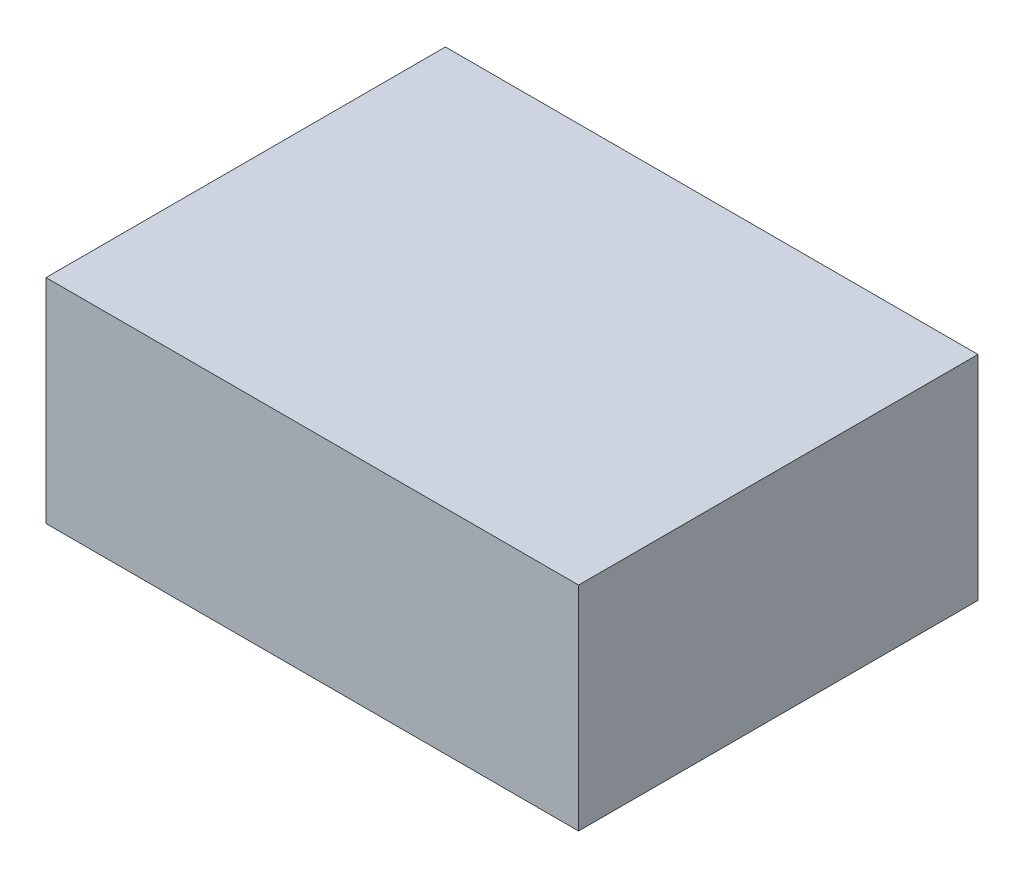
ISO-10303-21;
HEADER;
FILE_DESCRIPTION(('STEP AP214'),'2;1');
FILE_NAME('part.step','',(''),(''),'','','');
FILE_SCHEMA(('AUTOMOTIVE_DESIGN { 1 0 10303 214 1 1 1 1 }'));
ENDSEC;
DATA;
#1=APPLICATION_CONTEXT('core data for automotive mechanical design processes');
#2=APPLICATION_PROTOCOL_DEFINITION('international standard','automotive_design',2000,#1);
#3=PRODUCT_CONTEXT('',#1,'mechanical');
#4=PRODUCT('Part','Part','',(#3));
#5=PRODUCT_RELATED_PRODUCT_CATEGORY('part','',(#4));
#6=PRODUCT_DEFINITION_FORMATION('','',#4);
#7=PRODUCT_DEFINITION_CONTEXT('part definition',#1,'design');
#8=PRODUCT_DEFINITION('design','',#6,#7);
#9=PRODUCT_DEFINITION_SHAPE('','',#8);
#10=(LENGTH_UNIT() NAMED_UNIT(*) SI_UNIT(.MILLI.,.METRE.));
#11=(NAMED_UNIT(*) PLANE_ANGLE_UNIT() SI_UNIT($,.RADIAN.));
#12=(NAMED_UNIT(*) SI_UNIT($,.STERADIAN.) SOLID_ANGLE_UNIT());
#13=UNCERTAINTY_MEASURE_WITH_UNIT(LENGTH_MEASURE(1.E-05),#10,'distance_accuracy_value','');
#14=(GEOMETRIC_REPRESENTATION_CONTEXT(3) GLOBAL_UNCERTAINTY_ASSIGNED_CONTEXT((#13)) GLOBAL_UNIT_ASSIGNED_CONTEXT((#10,
#11,#12)) REPRESENTATION_CONTEXT('',''));
#15=CARTESIAN_POINT('',(0.,0.,0.));
#16=DIRECTION('',(0.,0.,1.));
#17=DIRECTION('',(1.,0.,0.));
#18=AXIS2_PLACEMENT_3D('',#15,#16,#17);
#19=CARTESIAN_POINT('',(10.,-8.,-7.5));
#20=DIRECTION('',(1.,0.,0.));
#21=DIRECTION('',(0.,0.,-1.));
#22=AXIS2_PLACEMENT_3D('',#19,#20,#21);
#23=PLANE('',#22);
#24=DIRECTION('',(0.,0.,-1.));
#25=VECTOR('',#24,1.);
#26=CARTESIAN_POINT('',(10.,0.,-7.5));
#27=LINE('',#26,#25);
#28=CARTESIAN_POINT('',(10.,0.,7.5));
#29=VERTEX_POINT('',#28);
#30=CARTESIAN_POINT('',(10.,0.,-7.5));
#31=VERTEX_POINT('',#30);
#32=EDGE_CURVE('E98',#29,#31,#27,.T.);
#33=ORIENTED_EDGE('',*,*,#32,.F.);
#34=DIRECTION('',(0.,1.,0.));
#35=VECTOR('',#34,1.);
#36=CARTESIAN_POINT('',(10.,-8.,7.5));
#37=LINE('',#36,#35);
#38=CARTESIAN_POINT('',(10.,-8.,7.5));
#39=VERTEX_POINT('',#38);
#40=EDGE_CURVE('E11',#39,#29,#37,.T.);
#41=ORIENTED_EDGE('',*,*,#40,.F.);
#42=DIRECTION('',(0.,0.,-1.));
#43=VECTOR('',#42,1.);
#44=CARTESIAN_POINT('',(10.,-8.,-7.5));
#45=LINE('',#44,#43);
#46=CARTESIAN_POINT('',(10.,-8.,-7.5));
#47=VERTEX_POINT('',#46);
#48=EDGE_CURVE('E92',#39,#47,#45,.T.);
#49=ORIENTED_EDGE('',*,*,#48,.T.);
#50=DIRECTION('',(0.,1.,0.));
#51=VECTOR('',#50,1.);
#52=CARTESIAN_POINT('',(10.,-8.,-7.5));
#53=LINE('',#52,#51);
#54=EDGE_CURVE('E37',#47,#31,#53,.T.);
#55=ORIENTED_EDGE('',*,*,#54,.T.);
#56=EDGE_LOOP('',(#33,#41,#49,#55));
#57=FACE_BOUND('',#56,.T.);
#58=ADVANCED_FACE('F34',(#57),#23,.T.);
#59=CARTESIAN_POINT('',(-10.,-8.,7.5));
#60=DIRECTION('',(0.,0.,1.));
#61=DIRECTION('',(1.,0.,0.));
#62=AXIS2_PLACEMENT_3D('',#59,#60,#61);
#63=PLANE('',#62);
#64=DIRECTION('',(1.,0.,0.));
#65=VECTOR('',#64,1.);
#66=CARTESIAN_POINT('',(-10.,0.,7.5));
#67=LINE('',#66,#65);
#68=CARTESIAN_POINT('',(-10.,0.,7.5));
#69=VERTEX_POINT('',#68);
#70=EDGE_CURVE('E94',#69,#29,#67,.T.);
#71=ORIENTED_EDGE('',*,*,#70,.F.);
#72=DIRECTION('',(0.,1.,0.));
#73=VECTOR('',#72,1.);
#74=CARTESIAN_POINT('',(-10.,-8.,7.5));
#75=LINE('',#74,#73);
#76=CARTESIAN_POINT('',(-10.,-8.,7.5));
#77=VERTEX_POINT('',#76);
#78=EDGE_CURVE('E43',#77,#69,#75,.T.);
#79=ORIENTED_EDGE('',*,*,#78,.F.);
#80=DIRECTION('',(1.,0.,0.));
#81=VECTOR('',#80,1.);
#82=CARTESIAN_POINT('',(-10.,-8.,7.5));
#83=LINE('',#82,#81);
#84=EDGE_CURVE('E89',#77,#39,#83,.T.);
#85=ORIENTED_EDGE('',*,*,#84,.T.);
#86=ORIENTED_EDGE('',*,*,#40,.T.);
#87=EDGE_LOOP('',(#71,#79,#85,#86));
#88=FACE_BOUND('',#87,.T.);
#89=ADVANCED_FACE('F108',(#88),#63,.T.);
#90=CARTESIAN_POINT('',(-10.,-8.,-7.5));
#91=DIRECTION('',(-1.,0.,0.));
#92=DIRECTION('',(0.,0.,1.));
#93=AXIS2_PLACEMENT_3D('',#90,#91,#92);
#94=PLANE('',#93);
#95=DIRECTION('',(0.,0.,1.));
#96=VECTOR('',#95,1.);
#97=CARTESIAN_POINT('',(-10.,0.,-7.5));
#98=LINE('',#97,#96);
#99=CARTESIAN_POINT('',(-10.,0.,-7.5));
#100=VERTEX_POINT('',#99);
#101=EDGE_CURVE('E84',#100,#69,#98,.T.);
#102=ORIENTED_EDGE('',*,*,#101,.F.);
#103=DIRECTION('',(0.,1.,0.));
#104=VECTOR('',#103,1.);
#105=CARTESIAN_POINT('',(-10.,-8.,-7.5));
#106=LINE('',#105,#104);
#107=CARTESIAN_POINT('',(-10.,-8.,-7.5));
#108=VERTEX_POINT('',#107);
#109=EDGE_CURVE('E79',#108,#100,#106,.T.);
#110=ORIENTED_EDGE('',*,*,#109,.F.);
#111=DIRECTION('',(0.,0.,1.));
#112=VECTOR('',#111,1.);
#113=CARTESIAN_POINT('',(-10.,-8.,-7.5));
#114=LINE('',#113,#112);
#115=EDGE_CURVE('E82',#108,#77,#114,.T.);
#116=ORIENTED_EDGE('',*,*,#115,.T.);
#117=ORIENTED_EDGE('',*,*,#78,.T.);
#118=EDGE_LOOP('',(#102,#110,#116,#117));
#119=FACE_BOUND('',#118,.T.);
#120=ADVANCED_FACE('F81',(#119),#94,.T.);
#121=CARTESIAN_POINT('',(-10.,-8.,-7.5));
#122=DIRECTION('',(0.,0.,-1.));
#123=DIRECTION('',(-1.,0.,0.));
#124=AXIS2_PLACEMENT_3D('',#121,#122,#123);
#125=PLANE('',#124);
#126=DIRECTION('',(-1.,0.,0.));
#127=VECTOR('',#126,1.);
#128=CARTESIAN_POINT('',(-10.,0.,-7.5));
#129=LINE('',#128,#127);
#130=EDGE_CURVE('E101',#31,#100,#129,.T.);
#131=ORIENTED_EDGE('',*,*,#130,.F.);
#132=ORIENTED_EDGE('',*,*,#54,.F.);
#133=DIRECTION('',(-1.,0.,0.));
#134=VECTOR('',#133,1.);
#135=CARTESIAN_POINT('',(-10.,-8.,-7.5));
#136=LINE('',#135,#134);
#137=EDGE_CURVE('E88',#47,#108,#136,.T.);
#138=ORIENTED_EDGE('',*,*,#137,.T.);
#139=ORIENTED_EDGE('',*,*,#109,.T.);
#140=EDGE_LOOP('',(#131,#132,#138,#139));
#141=FACE_BOUND('',#140,.T.);
#142=ADVANCED_FACE('F91',(#141),#125,.T.);
#143=CARTESIAN_POINT('',(0.,-8.,0.));
#144=DIRECTION('',(0.,1.,0.));
#145=DIRECTION('',(0.,0.,1.));
#146=AXIS2_PLACEMENT_3D('',#143,#144,#145);
#147=PLANE('',#146);
#148=ORIENTED_EDGE('',*,*,#48,.F.);
#149=ORIENTED_EDGE('',*,*,#84,.F.);
#150=ORIENTED_EDGE('',*,*,#115,.F.);
#151=ORIENTED_EDGE('',*,*,#137,.F.);
#152=EDGE_LOOP('',(#148,#149,#150,#151));
#153=FACE_BOUND('',#152,.T.);
#154=ADVANCED_FACE('F87',(#153),#147,.F.);
#155=CARTESIAN_POINT('',(0.,0.,0.));
#156=DIRECTION('',(0.,1.,0.));
#157=DIRECTION('',(0.,0.,1.));
#158=AXIS2_PLACEMENT_3D('',#155,#156,#157);
#159=PLANE('',#158);
#160=ORIENTED_EDGE('',*,*,#32,.T.);
#161=ORIENTED_EDGE('',*,*,#130,.T.);
#162=ORIENTED_EDGE('',*,*,#101,.T.);
#163=ORIENTED_EDGE('',*,*,#70,.T.);
#164=EDGE_LOOP('',(#160,#161,#162,#163));
#165=FACE_BOUND('',#164,.T.);
#166=ADVANCED_FACE('F107',(#165),#159,.T.);
#167=CLOSED_SHELL('',(#58,#89,#120,#142,#154,#166));
#168=MANIFOLD_SOLID_BREP('B2',#167);
#169=ADVANCED_BREP_SHAPE_REPRESENTATION('',(#18,#168),#14);
#170=SHAPE_DEFINITION_REPRESENTATION(#9,#169);
ENDSEC;
END-ISO-10303-21;
